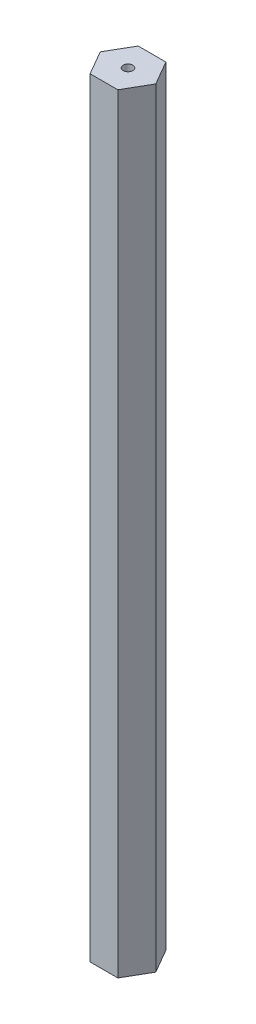
ISO-10303-21;
HEADER;
FILE_DESCRIPTION(('STEP AP214'),'2;1');
FILE_NAME('part.step','',(''),(''),'','','');
FILE_SCHEMA(('AUTOMOTIVE_DESIGN { 1 0 10303 214 1 1 1 1 }'));
ENDSEC;
DATA;
#1=APPLICATION_CONTEXT('core data for automotive mechanical design processes');
#2=APPLICATION_PROTOCOL_DEFINITION('international standard','automotive_design',2000,#1);
#3=PRODUCT_CONTEXT('',#1,'mechanical');
#4=PRODUCT('Part','Part','',(#3));
#5=PRODUCT_RELATED_PRODUCT_CATEGORY('part','',(#4));
#6=PRODUCT_DEFINITION_FORMATION('','',#4);
#7=PRODUCT_DEFINITION_CONTEXT('part definition',#1,'design');
#8=PRODUCT_DEFINITION('design','',#6,#7);
#9=PRODUCT_DEFINITION_SHAPE('','',#8);
#10=(LENGTH_UNIT() NAMED_UNIT(*) SI_UNIT(.MILLI.,.METRE.));
#11=(NAMED_UNIT(*) PLANE_ANGLE_UNIT() SI_UNIT($,.RADIAN.));
#12=(NAMED_UNIT(*) SI_UNIT($,.STERADIAN.) SOLID_ANGLE_UNIT());
#13=UNCERTAINTY_MEASURE_WITH_UNIT(LENGTH_MEASURE(1.E-05),#10,'distance_accuracy_value','');
#14=(GEOMETRIC_REPRESENTATION_CONTEXT(3) GLOBAL_UNCERTAINTY_ASSIGNED_CONTEXT((#13)) GLOBAL_UNIT_ASSIGNED_CONTEXT((#10,
#11,#12)) REPRESENTATION_CONTEXT('',''));
#15=CARTESIAN_POINT('',(0.,0.,0.));
#16=DIRECTION('',(0.,0.,1.));
#17=DIRECTION('',(1.,0.,0.));
#18=AXIS2_PLACEMENT_3D('',#15,#16,#17);
#19=CARTESIAN_POINT('',(0.,203.2,0.));
#20=DIRECTION('',(0.,1.,0.));
#21=DIRECTION('',(0.,0.,1.));
#22=AXIS2_PLACEMENT_3D('',#19,#20,#21);
#23=PLANE('',#22);
#24=DIRECTION('',(0.5,0.,-0.866025403784439));
#25=VECTOR('',#24,1.);
#26=CARTESIAN_POINT('',(3.66617420935412,203.2,6.35));
#27=LINE('',#26,#25);
#28=CARTESIAN_POINT('',(3.66617420935412,203.2,6.35));
#29=VERTEX_POINT('',#28);
#30=CARTESIAN_POINT('',(7.33234841870825,203.2,0.));
#31=VERTEX_POINT('',#30);
#32=EDGE_CURVE('E150',#29,#31,#27,.T.);
#33=ORIENTED_EDGE('',*,*,#32,.T.);
#34=DIRECTION('',(-0.500000000000001,0.,-0.866025403784438));
#35=VECTOR('',#34,1.);
#36=CARTESIAN_POINT('',(7.33234841870825,203.2,0.));
#37=LINE('',#36,#35);
#38=CARTESIAN_POINT('',(3.66617420935412,203.2,-6.35));
#39=VERTEX_POINT('',#38);
#40=EDGE_CURVE('E101',#31,#39,#37,.T.);
#41=ORIENTED_EDGE('',*,*,#40,.T.);
#42=DIRECTION('',(-1.,0.,0.));
#43=VECTOR('',#42,1.);
#44=CARTESIAN_POINT('',(3.66617420935412,203.2,-6.35));
#45=LINE('',#44,#43);
#46=CARTESIAN_POINT('',(-3.66617420935412,203.2,-6.35));
#47=VERTEX_POINT('',#46);
#48=EDGE_CURVE('E116',#39,#47,#45,.T.);
#49=ORIENTED_EDGE('',*,*,#48,.T.);
#50=DIRECTION('',(-0.5,0.,0.866025403784439));
#51=VECTOR('',#50,1.);
#52=CARTESIAN_POINT('',(-3.66617420935412,203.2,-6.35));
#53=LINE('',#52,#51);
#54=CARTESIAN_POINT('',(-7.33234841870824,203.2,0.));
#55=VERTEX_POINT('',#54);
#56=EDGE_CURVE('E110',#47,#55,#53,.T.);
#57=ORIENTED_EDGE('',*,*,#56,.T.);
#58=DIRECTION('',(0.5,0.,0.866025403784438));
#59=VECTOR('',#58,1.);
#60=CARTESIAN_POINT('',(-7.33234841870824,203.2,0.));
#61=LINE('',#60,#59);
#62=CARTESIAN_POINT('',(-3.66617420935412,203.2,6.35));
#63=VERTEX_POINT('',#62);
#64=EDGE_CURVE('E114',#55,#63,#61,.T.);
#65=ORIENTED_EDGE('',*,*,#64,.T.);
#66=DIRECTION('',(1.,0.,0.));
#67=VECTOR('',#66,1.);
#68=CARTESIAN_POINT('',(-3.66617420935412,203.2,6.35));
#69=LINE('',#68,#67);
#70=EDGE_CURVE('E63',#63,#29,#69,.T.);
#71=ORIENTED_EDGE('',*,*,#70,.T.);
#72=EDGE_LOOP('',(#33,#41,#49,#57,#65,#71));
#73=FACE_BOUND('',#72,.T.);
#74=CARTESIAN_POINT('',(0.,203.2,0.));
#75=DIRECTION('',(0.,1.,0.));
#76=DIRECTION('',(0.,0.,1.));
#77=AXIS2_PLACEMENT_3D('',#74,#75,#76);
#78=CIRCLE('',#77,1.27);
#79=CARTESIAN_POINT('',(0.,203.2,1.27));
#80=VERTEX_POINT('',#79);
#81=EDGE_CURVE('E143',#80,#80,#78,.T.);
#82=ORIENTED_EDGE('',*,*,#81,.F.);
#83=EDGE_LOOP('',(#82));
#84=FACE_BOUND('',#83,.T.);
#85=ADVANCED_FACE('F45',(#73,#84),#23,.T.);
#86=CARTESIAN_POINT('',(0.,0.,0.));
#87=DIRECTION('',(0.,1.,0.));
#88=DIRECTION('',(0.,0.,1.));
#89=AXIS2_PLACEMENT_3D('',#86,#87,#88);
#90=PLANE('',#89);
#91=DIRECTION('',(0.5,0.,-0.866025403784439));
#92=VECTOR('',#91,1.);
#93=CARTESIAN_POINT('',(3.66617420935412,0.,6.35));
#94=LINE('',#93,#92);
#95=CARTESIAN_POINT('',(3.66617420935412,0.,6.35));
#96=VERTEX_POINT('',#95);
#97=CARTESIAN_POINT('',(7.33234841870825,0.,0.));
#98=VERTEX_POINT('',#97);
#99=EDGE_CURVE('E139',#96,#98,#94,.T.);
#100=ORIENTED_EDGE('',*,*,#99,.F.);
#101=DIRECTION('',(1.,0.,0.));
#102=VECTOR('',#101,1.);
#103=CARTESIAN_POINT('',(-3.66617420935412,0.,6.35));
#104=LINE('',#103,#102);
#105=CARTESIAN_POINT('',(-3.66617420935412,0.,6.35));
#106=VERTEX_POINT('',#105);
#107=EDGE_CURVE('E93',#106,#96,#104,.T.);
#108=ORIENTED_EDGE('',*,*,#107,.F.);
#109=DIRECTION('',(0.5,0.,0.866025403784438));
#110=VECTOR('',#109,1.);
#111=CARTESIAN_POINT('',(-7.33234841870824,0.,0.));
#112=LINE('',#111,#110);
#113=CARTESIAN_POINT('',(-7.33234841870824,0.,0.));
#114=VERTEX_POINT('',#113);
#115=EDGE_CURVE('E87',#114,#106,#112,.T.);
#116=ORIENTED_EDGE('',*,*,#115,.F.);
#117=DIRECTION('',(-0.5,0.,0.866025403784439));
#118=VECTOR('',#117,1.);
#119=CARTESIAN_POINT('',(-3.66617420935412,0.,-6.35));
#120=LINE('',#119,#118);
#121=CARTESIAN_POINT('',(-3.66617420935412,0.,-6.35));
#122=VERTEX_POINT('',#121);
#123=EDGE_CURVE('E125',#122,#114,#120,.T.);
#124=ORIENTED_EDGE('',*,*,#123,.F.);
#125=DIRECTION('',(-1.,0.,0.));
#126=VECTOR('',#125,1.);
#127=CARTESIAN_POINT('',(3.66617420935412,0.,-6.35));
#128=LINE('',#127,#126);
#129=CARTESIAN_POINT('',(3.66617420935412,0.,-6.35));
#130=VERTEX_POINT('',#129);
#131=EDGE_CURVE('E145',#130,#122,#128,.T.);
#132=ORIENTED_EDGE('',*,*,#131,.F.);
#133=DIRECTION('',(-0.500000000000001,0.,-0.866025403784438));
#134=VECTOR('',#133,1.);
#135=CARTESIAN_POINT('',(7.33234841870825,0.,0.));
#136=LINE('',#135,#134);
#137=EDGE_CURVE('E142',#98,#130,#136,.T.);
#138=ORIENTED_EDGE('',*,*,#137,.F.);
#139=EDGE_LOOP('',(#100,#108,#116,#124,#132,#138));
#140=FACE_BOUND('',#139,.T.);
#141=CARTESIAN_POINT('',(0.,0.,0.));
#142=DIRECTION('',(0.,1.,0.));
#143=DIRECTION('',(0.,0.,1.));
#144=AXIS2_PLACEMENT_3D('',#141,#142,#143);
#145=CIRCLE('',#144,1.27);
#146=CARTESIAN_POINT('',(0.,0.,1.27));
#147=VERTEX_POINT('',#146);
#148=EDGE_CURVE('E271',#147,#147,#145,.T.);
#149=ORIENTED_EDGE('',*,*,#148,.T.);
#150=EDGE_LOOP('',(#149));
#151=FACE_BOUND('',#150,.T.);
#152=ADVANCED_FACE('F162',(#140,#151),#90,.F.);
#153=CARTESIAN_POINT('',(3.66617420935412,203.2,6.35));
#154=DIRECTION('',(-0.866025403784439,0.,-0.5));
#155=DIRECTION('',(-0.5,0.,0.866025403784439));
#156=AXIS2_PLACEMENT_3D('',#153,#154,#155);
#157=PLANE('',#156);
#158=ORIENTED_EDGE('',*,*,#99,.T.);
#159=DIRECTION('',(0.,-1.,0.));
#160=VECTOR('',#159,1.);
#161=CARTESIAN_POINT('',(7.33234841870825,203.2,0.));
#162=LINE('',#161,#160);
#163=EDGE_CURVE('E11',#31,#98,#162,.T.);
#164=ORIENTED_EDGE('',*,*,#163,.F.);
#165=ORIENTED_EDGE('',*,*,#32,.F.);
#166=DIRECTION('',(0.,-1.,0.));
#167=VECTOR('',#166,1.);
#168=CARTESIAN_POINT('',(3.66617420935412,203.2,6.35));
#169=LINE('',#168,#167);
#170=EDGE_CURVE('E135',#29,#96,#169,.T.);
#171=ORIENTED_EDGE('',*,*,#170,.T.);
#172=EDGE_LOOP('',(#158,#164,#165,#171));
#173=FACE_BOUND('',#172,.T.);
#174=ADVANCED_FACE('F47',(#173),#157,.F.);
#175=CARTESIAN_POINT('',(7.33234841870825,203.2,0.));
#176=DIRECTION('',(-0.866025403784438,0.,0.5));
#177=DIRECTION('',(0.500000000000001,0.,0.866025403784438));
#178=AXIS2_PLACEMENT_3D('',#175,#176,#177);
#179=PLANE('',#178);
#180=ORIENTED_EDGE('',*,*,#137,.T.);
#181=DIRECTION('',(0.,-1.,0.));
#182=VECTOR('',#181,1.);
#183=CARTESIAN_POINT('',(3.66617420935412,203.2,-6.35));
#184=LINE('',#183,#182);
#185=EDGE_CURVE('E55',#39,#130,#184,.T.);
#186=ORIENTED_EDGE('',*,*,#185,.F.);
#187=ORIENTED_EDGE('',*,*,#40,.F.);
#188=ORIENTED_EDGE('',*,*,#163,.T.);
#189=EDGE_LOOP('',(#180,#186,#187,#188));
#190=FACE_BOUND('',#189,.T.);
#191=ADVANCED_FACE('F187',(#190),#179,.F.);
#192=CARTESIAN_POINT('',(3.66617420935412,203.2,-6.35));
#193=DIRECTION('',(0.,0.,1.));
#194=DIRECTION('',(1.,0.,0.));
#195=AXIS2_PLACEMENT_3D('',#192,#193,#194);
#196=PLANE('',#195);
#197=ORIENTED_EDGE('',*,*,#131,.T.);
#198=DIRECTION('',(0.,-1.,0.));
#199=VECTOR('',#198,1.);
#200=CARTESIAN_POINT('',(-3.66617420935412,203.2,-6.35));
#201=LINE('',#200,#199);
#202=EDGE_CURVE('E127',#47,#122,#201,.T.);
#203=ORIENTED_EDGE('',*,*,#202,.F.);
#204=ORIENTED_EDGE('',*,*,#48,.F.);
#205=ORIENTED_EDGE('',*,*,#185,.T.);
#206=EDGE_LOOP('',(#197,#203,#204,#205));
#207=FACE_BOUND('',#206,.T.);
#208=ADVANCED_FACE('F159',(#207),#196,.F.);
#209=CARTESIAN_POINT('',(-3.66617420935412,203.2,-6.35));
#210=DIRECTION('',(0.866025403784439,0.,0.5));
#211=DIRECTION('',(0.5,0.,-0.866025403784439));
#212=AXIS2_PLACEMENT_3D('',#209,#210,#211);
#213=PLANE('',#212);
#214=ORIENTED_EDGE('',*,*,#123,.T.);
#215=DIRECTION('',(0.,-1.,0.));
#216=VECTOR('',#215,1.);
#217=CARTESIAN_POINT('',(-7.33234841870824,203.2,0.));
#218=LINE('',#217,#216);
#219=EDGE_CURVE('E122',#55,#114,#218,.T.);
#220=ORIENTED_EDGE('',*,*,#219,.F.);
#221=ORIENTED_EDGE('',*,*,#56,.F.);
#222=ORIENTED_EDGE('',*,*,#202,.T.);
#223=EDGE_LOOP('',(#214,#220,#221,#222));
#224=FACE_BOUND('',#223,.T.);
#225=ADVANCED_FACE('F123',(#224),#213,.F.);
#226=CARTESIAN_POINT('',(-7.33234841870824,203.2,0.));
#227=DIRECTION('',(0.866025403784439,0.,-0.5));
#228=DIRECTION('',(-0.5,0.,-0.866025403784439));
#229=AXIS2_PLACEMENT_3D('',#226,#227,#228);
#230=PLANE('',#229);
#231=ORIENTED_EDGE('',*,*,#115,.T.);
#232=DIRECTION('',(0.,-1.,0.));
#233=VECTOR('',#232,1.);
#234=CARTESIAN_POINT('',(-3.66617420935412,203.2,6.35));
#235=LINE('',#234,#233);
#236=EDGE_CURVE('E128',#63,#106,#235,.T.);
#237=ORIENTED_EDGE('',*,*,#236,.F.);
#238=ORIENTED_EDGE('',*,*,#64,.F.);
#239=ORIENTED_EDGE('',*,*,#219,.T.);
#240=EDGE_LOOP('',(#231,#237,#238,#239));
#241=FACE_BOUND('',#240,.T.);
#242=ADVANCED_FACE('F130',(#241),#230,.F.);
#243=CARTESIAN_POINT('',(-3.66617420935412,203.2,6.35));
#244=DIRECTION('',(0.,0.,-1.));
#245=DIRECTION('',(-1.,0.,0.));
#246=AXIS2_PLACEMENT_3D('',#243,#244,#245);
#247=PLANE('',#246);
#248=ORIENTED_EDGE('',*,*,#107,.T.);
#249=ORIENTED_EDGE('',*,*,#170,.F.);
#250=ORIENTED_EDGE('',*,*,#70,.F.);
#251=ORIENTED_EDGE('',*,*,#236,.T.);
#252=EDGE_LOOP('',(#248,#249,#250,#251));
#253=FACE_BOUND('',#252,.T.);
#254=ADVANCED_FACE('F167',(#253),#247,.F.);
#255=CARTESIAN_POINT('',(0.,203.2,0.));
#256=DIRECTION('',(0.,-1.,0.));
#257=DIRECTION('',(0.,0.,-1.));
#258=AXIS2_PLACEMENT_3D('',#255,#256,#257);
#259=CYLINDRICAL_SURFACE('',#258,1.27);
#260=ORIENTED_EDGE('',*,*,#81,.T.);
#261=EDGE_LOOP('',(#260));
#262=FACE_BOUND('',#261,.T.);
#263=ORIENTED_EDGE('',*,*,#148,.F.);
#264=EDGE_LOOP('',(#263));
#265=FACE_BOUND('',#264,.T.);
#266=ADVANCED_FACE('F169',(#262,#265),#259,.F.);
#267=CLOSED_SHELL('',(#85,#152,#174,#191,#208,#225,#242,#254,#266));
#268=MANIFOLD_SOLID_BREP('B2',#267);
#269=ADVANCED_BREP_SHAPE_REPRESENTATION('',(#18,#268),#14);
#270=SHAPE_DEFINITION_REPRESENTATION(#9,#269);
ENDSEC;
END-ISO-10303-21;
